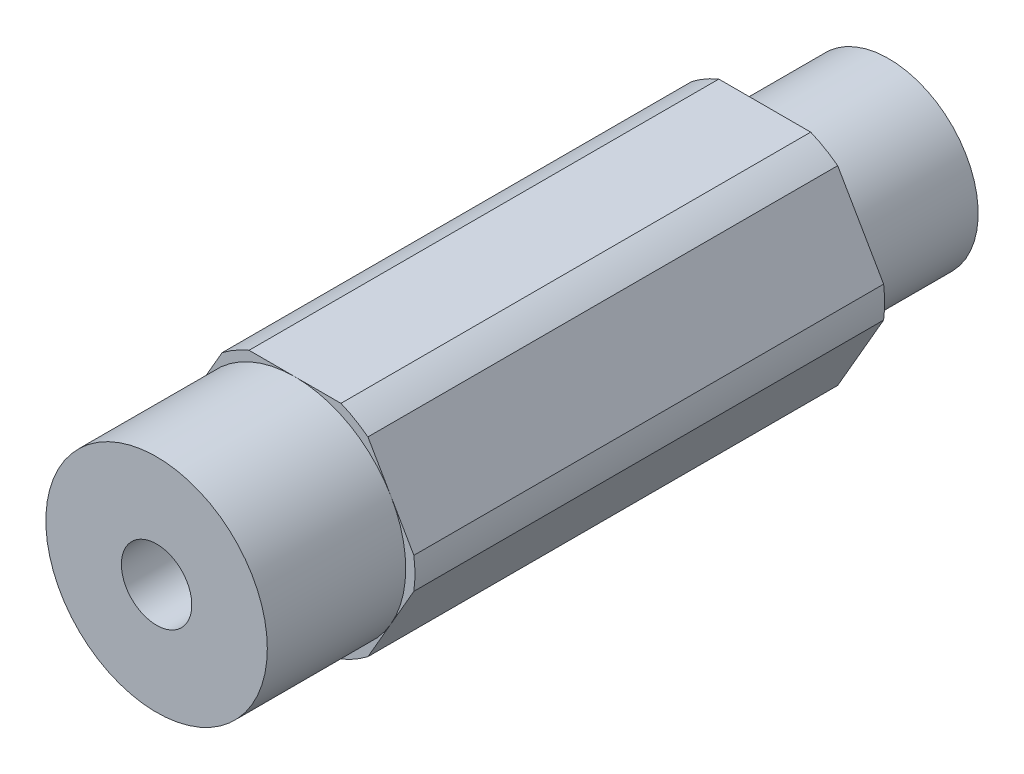
ISO-10303-21;
HEADER;
FILE_DESCRIPTION(('STEP AP214'),'2;1');
FILE_NAME('part.step','',(''),(''),'','','');
FILE_SCHEMA(('AUTOMOTIVE_DESIGN { 1 0 10303 214 1 1 1 1 }'));
ENDSEC;
DATA;
#1=APPLICATION_CONTEXT('core data for automotive mechanical design processes');
#2=APPLICATION_PROTOCOL_DEFINITION('international standard','automotive_design',2000,#1);
#3=PRODUCT_CONTEXT('',#1,'mechanical');
#4=PRODUCT('Part','Part','',(#3));
#5=PRODUCT_RELATED_PRODUCT_CATEGORY('part','',(#4));
#6=PRODUCT_DEFINITION_FORMATION('','',#4);
#7=PRODUCT_DEFINITION_CONTEXT('part definition',#1,'design');
#8=PRODUCT_DEFINITION('design','',#6,#7);
#9=PRODUCT_DEFINITION_SHAPE('','',#8);
#10=(LENGTH_UNIT() NAMED_UNIT(*) SI_UNIT(.MILLI.,.METRE.));
#11=(NAMED_UNIT(*) PLANE_ANGLE_UNIT() SI_UNIT($,.RADIAN.));
#12=(NAMED_UNIT(*) SI_UNIT($,.STERADIAN.) SOLID_ANGLE_UNIT());
#13=UNCERTAINTY_MEASURE_WITH_UNIT(LENGTH_MEASURE(1.E-05),#10,'distance_accuracy_value','');
#14=(GEOMETRIC_REPRESENTATION_CONTEXT(3) GLOBAL_UNCERTAINTY_ASSIGNED_CONTEXT((#13)) GLOBAL_UNIT_ASSIGNED_CONTEXT((#10,
#11,#12)) REPRESENTATION_CONTEXT('',''));
#15=CARTESIAN_POINT('',(0.,0.,0.));
#16=DIRECTION('',(0.,0.,1.));
#17=DIRECTION('',(1.,0.,0.));
#18=AXIS2_PLACEMENT_3D('',#15,#16,#17);
#19=CARTESIAN_POINT('',(5.49926131403115,3.17499999999999,20.9931));
#20=DIRECTION('',(-0.866025403784438,-0.500000000000001,0.));
#21=DIRECTION('',(0.500000000000001,-0.866025403784438,0.));
#22=AXIS2_PLACEMENT_3D('',#19,#20,#21);
#23=PLANE('',#22);
#24=DIRECTION('',(0.500000000000001,-0.866025403784438,0.));
#25=VECTOR('',#24,1.);
#26=CARTESIAN_POINT('',(5.49926131403115,3.17499999999999,-13.8811));
#27=LINE('',#26,#25);
#28=CARTESIAN_POINT('',(4.18177084608646,5.45696042896789,-13.8811));
#29=VERTEX_POINT('',#28);
#30=CARTESIAN_POINT('',(6.81675178197584,0.89303957103209,-13.8811));
#31=VERTEX_POINT('',#30);
#32=EDGE_CURVE('E71',#29,#31,#27,.T.);
#33=ORIENTED_EDGE('',*,*,#32,.F.);
#34=DIRECTION('',(0.,0.,-1.));
#35=VECTOR('',#34,1.);
#36=CARTESIAN_POINT('',(4.18177084608646,5.45696042896789,20.9931));
#37=LINE('',#36,#35);
#38=CARTESIAN_POINT('',(4.18177084608646,5.45696042896789,13.0556));
#39=VERTEX_POINT('',#38);
#40=EDGE_CURVE('E212',#39,#29,#37,.T.);
#41=ORIENTED_EDGE('',*,*,#40,.F.);
#42=DIRECTION('',(-0.500000000000001,0.866025403784438,0.));
#43=VECTOR('',#42,1.);
#44=CARTESIAN_POINT('',(5.49926131403115,3.17499999999999,13.0556));
#45=LINE('',#44,#43);
#46=CARTESIAN_POINT('',(5.49926131403118,3.17500000000001,13.0556));
#47=VERTEX_POINT('',#46);
#48=EDGE_CURVE('E224',#47,#39,#45,.T.);
#49=ORIENTED_EDGE('',*,*,#48,.F.);
#50=CARTESIAN_POINT('',(6.81675178197584,0.89303957103209,13.0556));
#51=VERTEX_POINT('',#50);
#52=EDGE_CURVE('E219',#51,#47,#45,.T.);
#53=ORIENTED_EDGE('',*,*,#52,.F.);
#54=DIRECTION('',(0.,0.,-1.));
#55=VECTOR('',#54,1.);
#56=CARTESIAN_POINT('',(6.81675178197584,0.89303957103209,20.9931));
#57=LINE('',#56,#55);
#58=EDGE_CURVE('E181',#51,#31,#57,.T.);
#59=ORIENTED_EDGE('',*,*,#58,.T.);
#60=EDGE_LOOP('',(#33,#41,#49,#53,#59));
#61=FACE_BOUND('',#60,.T.);
#62=ADVANCED_FACE('F57',(#61),#23,.F.);
#63=CARTESIAN_POINT('',(0.,0.,20.9931));
#64=DIRECTION('',(0.,0.,-1.));
#65=DIRECTION('',(-1.,0.,0.));
#66=AXIS2_PLACEMENT_3D('',#63,#64,#65);
#67=CYLINDRICAL_SURFACE('',#66,6.874999966);
#68=CARTESIAN_POINT('',(0.,0.,-13.8811));
#69=DIRECTION('',(0.,0.,-1.));
#70=DIRECTION('',(-1.,0.,0.));
#71=AXIS2_PLACEMENT_3D('',#68,#69,#70);
#72=CIRCLE('',#71,6.874999966);
#73=CARTESIAN_POINT('',(2.63498093588936,6.34999999999997,-13.8811));
#74=VERTEX_POINT('',#73);
#75=EDGE_CURVE('E300',#74,#29,#72,.T.);
#76=ORIENTED_EDGE('',*,*,#75,.F.);
#77=DIRECTION('',(0.,0.,-1.));
#78=VECTOR('',#77,1.);
#79=CARTESIAN_POINT('',(2.63498093588936,6.34999999999997,20.9931));
#80=LINE('',#79,#78);
#81=CARTESIAN_POINT('',(2.63498093588936,6.34999999999997,13.0556));
#82=VERTEX_POINT('',#81);
#83=EDGE_CURVE('E209',#82,#74,#80,.T.);
#84=ORIENTED_EDGE('',*,*,#83,.F.);
#85=CARTESIAN_POINT('',(0.,0.,13.0556));
#86=DIRECTION('',(0.,0.,1.));
#87=DIRECTION('',(1.,0.,0.));
#88=AXIS2_PLACEMENT_3D('',#85,#86,#87);
#89=CIRCLE('',#88,6.874999966);
#90=EDGE_CURVE('E228',#39,#82,#89,.T.);
#91=ORIENTED_EDGE('',*,*,#90,.F.);
#92=ORIENTED_EDGE('',*,*,#40,.T.);
#93=EDGE_LOOP('',(#76,#84,#91,#92));
#94=FACE_BOUND('',#93,.T.);
#95=ADVANCED_FACE('F299',(#94),#67,.T.);
#96=CARTESIAN_POINT('',(0.,6.34999999999996,20.9931));
#97=DIRECTION('',(0.,-1.,0.));
#98=DIRECTION('',(1.,0.,0.));
#99=AXIS2_PLACEMENT_3D('',#96,#97,#98);
#100=PLANE('',#99);
#101=DIRECTION('',(1.,0.,0.));
#102=VECTOR('',#101,1.);
#103=CARTESIAN_POINT('',(0.,6.34999999999996,-13.8811));
#104=LINE('',#103,#102);
#105=CARTESIAN_POINT('',(-2.6349809358894,6.34999999999995,-13.8811));
#106=VERTEX_POINT('',#105);
#107=EDGE_CURVE('E301',#106,#74,#104,.T.);
#108=ORIENTED_EDGE('',*,*,#107,.F.);
#109=DIRECTION('',(0.,0.,-1.));
#110=VECTOR('',#109,1.);
#111=CARTESIAN_POINT('',(-2.6349809358894,6.34999999999995,20.9931));
#112=LINE('',#111,#110);
#113=CARTESIAN_POINT('',(-2.6349809358894,6.34999999999995,13.0556));
#114=VERTEX_POINT('',#113);
#115=EDGE_CURVE('E206',#114,#106,#112,.T.);
#116=ORIENTED_EDGE('',*,*,#115,.F.);
#117=DIRECTION('',(-1.,0.,0.));
#118=VECTOR('',#117,1.);
#119=CARTESIAN_POINT('',(0.,6.34999999999996,13.0556));
#120=LINE('',#119,#118);
#121=CARTESIAN_POINT('',(0.,6.35,13.0556));
#122=VERTEX_POINT('',#121);
#123=EDGE_CURVE('E289',#122,#114,#120,.T.);
#124=ORIENTED_EDGE('',*,*,#123,.F.);
#125=EDGE_CURVE('E264',#82,#122,#120,.T.);
#126=ORIENTED_EDGE('',*,*,#125,.F.);
#127=ORIENTED_EDGE('',*,*,#83,.T.);
#128=EDGE_LOOP('',(#108,#116,#124,#126,#127));
#129=FACE_BOUND('',#128,.T.);
#130=ADVANCED_FACE('F296',(#129),#100,.F.);
#131=CARTESIAN_POINT('',(0.,0.,-13.8811));
#132=DIRECTION('',(0.,0.,-1.));
#133=DIRECTION('',(-1.,0.,0.));
#134=AXIS2_PLACEMENT_3D('',#131,#132,#133);
#135=CIRCLE('',#134,6.874999966);
#136=CARTESIAN_POINT('',(-4.18177084608649,5.45696042896786,-13.8811));
#137=VERTEX_POINT('',#136);
#138=EDGE_CURVE('E302',#137,#106,#135,.T.);
#139=ORIENTED_EDGE('',*,*,#138,.F.);
#140=DIRECTION('',(0.,0.,-1.));
#141=VECTOR('',#140,1.);
#142=CARTESIAN_POINT('',(-4.18177084608649,5.45696042896786,20.9931));
#143=LINE('',#142,#141);
#144=CARTESIAN_POINT('',(-4.18177084608649,5.45696042896786,13.0556));
#145=VERTEX_POINT('',#144);
#146=EDGE_CURVE('E203',#145,#137,#143,.T.);
#147=ORIENTED_EDGE('',*,*,#146,.F.);
#148=CARTESIAN_POINT('',(0.,0.,13.0556));
#149=DIRECTION('',(0.,0.,1.));
#150=DIRECTION('',(1.,0.,0.));
#151=AXIS2_PLACEMENT_3D('',#148,#149,#150);
#152=CIRCLE('',#151,6.874999966);
#153=EDGE_CURVE('E288',#114,#145,#152,.T.);
#154=ORIENTED_EDGE('',*,*,#153,.F.);
#155=ORIENTED_EDGE('',*,*,#115,.T.);
#156=EDGE_LOOP('',(#139,#147,#154,#155));
#157=FACE_BOUND('',#156,.T.);
#158=ADVANCED_FACE('F337',(#157),#67,.T.);
#159=CARTESIAN_POINT('',(-5.49926131403117,3.17499999999995,20.9931));
#160=DIRECTION('',(0.866025403784442,-0.499999999999995,0.));
#161=DIRECTION('',(0.499999999999995,0.866025403784442,0.));
#162=AXIS2_PLACEMENT_3D('',#159,#160,#161);
#163=PLANE('',#162);
#164=DIRECTION('',(0.499999999999995,0.866025403784442,0.));
#165=VECTOR('',#164,1.);
#166=CARTESIAN_POINT('',(-5.49926131403117,3.17499999999995,-13.8811));
#167=LINE('',#166,#165);
#168=CARTESIAN_POINT('',(-6.81675178197585,0.893039571032039,-13.8811));
#169=VERTEX_POINT('',#168);
#170=EDGE_CURVE('E306',#169,#137,#167,.T.);
#171=ORIENTED_EDGE('',*,*,#170,.F.);
#172=DIRECTION('',(0.,0.,-1.));
#173=VECTOR('',#172,1.);
#174=CARTESIAN_POINT('',(-6.81675178197585,0.893039571032039,20.9931));
#175=LINE('',#174,#173);
#176=CARTESIAN_POINT('',(-6.81675178197585,0.893039571032039,13.0556));
#177=VERTEX_POINT('',#176);
#178=EDGE_CURVE('E200',#177,#169,#175,.T.);
#179=ORIENTED_EDGE('',*,*,#178,.F.);
#180=DIRECTION('',(-0.499999999999995,-0.866025403784442,0.));
#181=VECTOR('',#180,1.);
#182=CARTESIAN_POINT('',(-5.49926131403117,3.17499999999995,13.0556));
#183=LINE('',#182,#181);
#184=CARTESIAN_POINT('',(-5.4992613140312,3.17499999999997,13.0556));
#185=VERTEX_POINT('',#184);
#186=EDGE_CURVE('E285',#185,#177,#183,.T.);
#187=ORIENTED_EDGE('',*,*,#186,.F.);
#188=EDGE_CURVE('E287',#145,#185,#183,.T.);
#189=ORIENTED_EDGE('',*,*,#188,.F.);
#190=ORIENTED_EDGE('',*,*,#146,.T.);
#191=EDGE_LOOP('',(#171,#179,#187,#189,#190));
#192=FACE_BOUND('',#191,.T.);
#193=ADVANCED_FACE('F341',(#192),#163,.F.);
#194=CARTESIAN_POINT('',(0.,0.,-13.8811));
#195=DIRECTION('',(0.,0.,-1.));
#196=DIRECTION('',(-1.,0.,0.));
#197=AXIS2_PLACEMENT_3D('',#194,#195,#196);
#198=CIRCLE('',#197,6.874999966);
#199=CARTESIAN_POINT('',(-6.81675178197584,-0.893039571032139,-13.8811));
#200=VERTEX_POINT('',#199);
#201=EDGE_CURVE('E308',#200,#169,#198,.T.);
#202=ORIENTED_EDGE('',*,*,#201,.F.);
#203=DIRECTION('',(0.,0.,-1.));
#204=VECTOR('',#203,1.);
#205=CARTESIAN_POINT('',(-6.81675178197584,-0.893039571032139,20.9931));
#206=LINE('',#205,#204);
#207=CARTESIAN_POINT('',(-6.81675178197584,-0.893039571032139,13.0556));
#208=VERTEX_POINT('',#207);
#209=EDGE_CURVE('E197',#208,#200,#206,.T.);
#210=ORIENTED_EDGE('',*,*,#209,.F.);
#211=CARTESIAN_POINT('',(0.,0.,13.0556));
#212=DIRECTION('',(0.,0.,1.));
#213=DIRECTION('',(1.,0.,0.));
#214=AXIS2_PLACEMENT_3D('',#211,#212,#213);
#215=CIRCLE('',#214,6.874999966);
#216=EDGE_CURVE('E283',#177,#208,#215,.T.);
#217=ORIENTED_EDGE('',*,*,#216,.F.);
#218=ORIENTED_EDGE('',*,*,#178,.T.);
#219=EDGE_LOOP('',(#202,#210,#217,#218));
#220=FACE_BOUND('',#219,.T.);
#221=ADVANCED_FACE('F344',(#220),#67,.T.);
#222=CARTESIAN_POINT('',(-5.49926131403113,-3.17500000000003,20.9931));
#223=DIRECTION('',(0.866025403784434,0.500000000000007,0.));
#224=DIRECTION('',(-0.500000000000007,0.866025403784435,0.));
#225=AXIS2_PLACEMENT_3D('',#222,#223,#224);
#226=PLANE('',#225);
#227=DIRECTION('',(-0.500000000000007,0.866025403784435,0.));
#228=VECTOR('',#227,1.);
#229=CARTESIAN_POINT('',(-5.49926131403113,-3.17500000000003,-13.8811));
#230=LINE('',#229,#228);
#231=CARTESIAN_POINT('',(-4.18177084608642,-5.45696042896791,-13.8811));
#232=VERTEX_POINT('',#231);
#233=EDGE_CURVE('E310',#232,#200,#230,.T.);
#234=ORIENTED_EDGE('',*,*,#233,.F.);
#235=DIRECTION('',(0.,0.,-1.));
#236=VECTOR('',#235,1.);
#237=CARTESIAN_POINT('',(-4.18177084608642,-5.45696042896791,20.9931));
#238=LINE('',#237,#236);
#239=CARTESIAN_POINT('',(-4.18177084608642,-5.45696042896791,13.0556));
#240=VERTEX_POINT('',#239);
#241=EDGE_CURVE('E194',#240,#232,#238,.T.);
#242=ORIENTED_EDGE('',*,*,#241,.F.);
#243=DIRECTION('',(0.500000000000007,-0.866025403784435,0.));
#244=VECTOR('',#243,1.);
#245=CARTESIAN_POINT('',(-5.49926131403113,-3.17500000000003,13.0556));
#246=LINE('',#245,#244);
#247=CARTESIAN_POINT('',(-5.49926131403116,-3.17500000000004,13.0556));
#248=VERTEX_POINT('',#247);
#249=EDGE_CURVE('E280',#248,#240,#246,.T.);
#250=ORIENTED_EDGE('',*,*,#249,.F.);
#251=EDGE_CURVE('E282',#208,#248,#246,.T.);
#252=ORIENTED_EDGE('',*,*,#251,.F.);
#253=ORIENTED_EDGE('',*,*,#209,.T.);
#254=EDGE_LOOP('',(#234,#242,#250,#252,#253));
#255=FACE_BOUND('',#254,.T.);
#256=ADVANCED_FACE('F346',(#255),#226,.F.);
#257=CARTESIAN_POINT('',(0.,0.,-13.8811));
#258=DIRECTION('',(0.,0.,-1.));
#259=DIRECTION('',(-1.,0.,0.));
#260=AXIS2_PLACEMENT_3D('',#257,#258,#259);
#261=CIRCLE('',#260,6.874999966);
#262=CARTESIAN_POINT('',(-2.63498093588932,-6.34999999999999,-13.8811));
#263=VERTEX_POINT('',#262);
#264=EDGE_CURVE('E312',#263,#232,#261,.T.);
#265=ORIENTED_EDGE('',*,*,#264,.F.);
#266=DIRECTION('',(0.,0.,-1.));
#267=VECTOR('',#266,1.);
#268=CARTESIAN_POINT('',(-2.63498093588932,-6.34999999999999,20.9931));
#269=LINE('',#268,#267);
#270=CARTESIAN_POINT('',(-2.63498093588932,-6.34999999999999,13.0556));
#271=VERTEX_POINT('',#270);
#272=EDGE_CURVE('E191',#271,#263,#269,.T.);
#273=ORIENTED_EDGE('',*,*,#272,.F.);
#274=CARTESIAN_POINT('',(0.,0.,13.0556));
#275=DIRECTION('',(0.,0.,1.));
#276=DIRECTION('',(1.,0.,0.));
#277=AXIS2_PLACEMENT_3D('',#274,#275,#276);
#278=CIRCLE('',#277,6.874999966);
#279=EDGE_CURVE('E278',#240,#271,#278,.T.);
#280=ORIENTED_EDGE('',*,*,#279,.F.);
#281=ORIENTED_EDGE('',*,*,#241,.T.);
#282=EDGE_LOOP('',(#265,#273,#280,#281));
#283=FACE_BOUND('',#282,.T.);
#284=ADVANCED_FACE('F349',(#283),#67,.T.);
#285=CARTESIAN_POINT('',(0.,-6.34999999999996,20.9931));
#286=DIRECTION('',(0.,1.,0.));
#287=DIRECTION('',(-1.,0.,0.));
#288=AXIS2_PLACEMENT_3D('',#285,#286,#287);
#289=PLANE('',#288);
#290=DIRECTION('',(-1.,0.,0.));
#291=VECTOR('',#290,1.);
#292=CARTESIAN_POINT('',(0.,-6.34999999999996,-13.8811));
#293=LINE('',#292,#291);
#294=CARTESIAN_POINT('',(2.63498093588945,-6.34999999999994,-13.8811));
#295=VERTEX_POINT('',#294);
#296=EDGE_CURVE('E314',#295,#263,#293,.T.);
#297=ORIENTED_EDGE('',*,*,#296,.F.);
#298=DIRECTION('',(0.,0.,-1.));
#299=VECTOR('',#298,1.);
#300=CARTESIAN_POINT('',(2.63498093588945,-6.34999999999993,20.9931));
#301=LINE('',#300,#299);
#302=CARTESIAN_POINT('',(2.63498093588945,-6.34999999999994,13.0556));
#303=VERTEX_POINT('',#302);
#304=EDGE_CURVE('E183',#303,#295,#301,.T.);
#305=ORIENTED_EDGE('',*,*,#304,.F.);
#306=DIRECTION('',(1.,0.,0.));
#307=VECTOR('',#306,1.);
#308=CARTESIAN_POINT('',(0.,-6.34999999999996,13.0556));
#309=LINE('',#308,#307);
#310=CARTESIAN_POINT('',(0.,-6.35,13.0556));
#311=VERTEX_POINT('',#310);
#312=EDGE_CURVE('E275',#311,#303,#309,.T.);
#313=ORIENTED_EDGE('',*,*,#312,.F.);
#314=EDGE_CURVE('E277',#271,#311,#309,.T.);
#315=ORIENTED_EDGE('',*,*,#314,.F.);
#316=ORIENTED_EDGE('',*,*,#272,.T.);
#317=EDGE_LOOP('',(#297,#305,#313,#315,#316));
#318=FACE_BOUND('',#317,.T.);
#319=ADVANCED_FACE('F351',(#318),#289,.F.);
#320=CARTESIAN_POINT('',(0.,0.,-13.8811));
#321=DIRECTION('',(0.,0.,-1.));
#322=DIRECTION('',(-1.,0.,0.));
#323=AXIS2_PLACEMENT_3D('',#320,#321,#322);
#324=CIRCLE('',#323,6.874999966);
#325=CARTESIAN_POINT('',(4.18177084608655,-5.45696042896781,-13.8811));
#326=VERTEX_POINT('',#325);
#327=EDGE_CURVE('E177',#326,#295,#324,.T.);
#328=ORIENTED_EDGE('',*,*,#327,.F.);
#329=DIRECTION('',(0.,0.,-1.));
#330=VECTOR('',#329,1.);
#331=CARTESIAN_POINT('',(4.18177084608655,-5.45696042896782,20.9931));
#332=LINE('',#331,#330);
#333=CARTESIAN_POINT('',(4.18177084608655,-5.45696042896781,13.0556));
#334=VERTEX_POINT('',#333);
#335=EDGE_CURVE('E176',#334,#326,#332,.T.);
#336=ORIENTED_EDGE('',*,*,#335,.F.);
#337=CARTESIAN_POINT('',(0.,0.,13.0556));
#338=DIRECTION('',(0.,0.,1.));
#339=DIRECTION('',(1.,0.,0.));
#340=AXIS2_PLACEMENT_3D('',#337,#338,#339);
#341=CIRCLE('',#340,6.874999966);
#342=EDGE_CURVE('E273',#303,#334,#341,.T.);
#343=ORIENTED_EDGE('',*,*,#342,.F.);
#344=ORIENTED_EDGE('',*,*,#304,.T.);
#345=EDGE_LOOP('',(#328,#336,#343,#344));
#346=FACE_BOUND('',#345,.T.);
#347=ADVANCED_FACE('F354',(#346),#67,.T.);
#348=CARTESIAN_POINT('',(5.49926131403119,-3.17499999999996,20.9931));
#349=DIRECTION('',(-0.866025403784441,0.499999999999995,0.));
#350=DIRECTION('',(-0.499999999999995,-0.866025403784442,0.));
#351=AXIS2_PLACEMENT_3D('',#348,#349,#350);
#352=PLANE('',#351);
#353=DIRECTION('',(-0.499999999999995,-0.866025403784442,0.));
#354=VECTOR('',#353,1.);
#355=CARTESIAN_POINT('',(5.49926131403119,-3.17499999999996,-13.8811));
#356=LINE('',#355,#354);
#357=CARTESIAN_POINT('',(6.81675178197584,-0.893039571032111,-13.8811));
#358=VERTEX_POINT('',#357);
#359=EDGE_CURVE('E163',#358,#326,#356,.T.);
#360=ORIENTED_EDGE('',*,*,#359,.F.);
#361=DIRECTION('',(0.,0.,-1.));
#362=VECTOR('',#361,1.);
#363=CARTESIAN_POINT('',(6.81675178197584,-0.893039571032111,20.9931));
#364=LINE('',#363,#362);
#365=CARTESIAN_POINT('',(6.81675178197584,-0.893039571032111,13.0556));
#366=VERTEX_POINT('',#365);
#367=EDGE_CURVE('E173',#366,#358,#364,.T.);
#368=ORIENTED_EDGE('',*,*,#367,.F.);
#369=DIRECTION('',(0.499999999999995,0.866025403784442,0.));
#370=VECTOR('',#369,1.);
#371=CARTESIAN_POINT('',(5.49926131403119,-3.17499999999996,13.0556));
#372=LINE('',#371,#370);
#373=CARTESIAN_POINT('',(5.4992613140312,-3.17499999999997,13.0556));
#374=VERTEX_POINT('',#373);
#375=EDGE_CURVE('E79',#374,#366,#372,.T.);
#376=ORIENTED_EDGE('',*,*,#375,.F.);
#377=EDGE_CURVE('E267',#334,#374,#372,.T.);
#378=ORIENTED_EDGE('',*,*,#377,.F.);
#379=ORIENTED_EDGE('',*,*,#335,.T.);
#380=EDGE_LOOP('',(#360,#368,#376,#378,#379));
#381=FACE_BOUND('',#380,.T.);
#382=ADVANCED_FACE('F172',(#381),#352,.F.);
#383=CARTESIAN_POINT('',(0.,0.,-13.8811));
#384=DIRECTION('',(0.,0.,-1.));
#385=DIRECTION('',(-1.,0.,0.));
#386=AXIS2_PLACEMENT_3D('',#383,#384,#385);
#387=CIRCLE('',#386,6.874999966);
#388=EDGE_CURVE('E12',#31,#358,#387,.T.);
#389=ORIENTED_EDGE('',*,*,#388,.F.);
#390=ORIENTED_EDGE('',*,*,#58,.F.);
#391=CARTESIAN_POINT('',(0.,0.,13.0556));
#392=DIRECTION('',(0.,0.,1.));
#393=DIRECTION('',(1.,0.,0.));
#394=AXIS2_PLACEMENT_3D('',#391,#392,#393);
#395=CIRCLE('',#394,6.874999966);
#396=EDGE_CURVE('E65',#366,#51,#395,.T.);
#397=ORIENTED_EDGE('',*,*,#396,.F.);
#398=ORIENTED_EDGE('',*,*,#367,.T.);
#399=EDGE_LOOP('',(#389,#390,#397,#398));
#400=FACE_BOUND('',#399,.T.);
#401=ADVANCED_FACE('F180',(#400),#67,.T.);
#402=CARTESIAN_POINT('',(0.,0.,-20.9931));
#403=DIRECTION('',(0.,0.,1.));
#404=DIRECTION('',(1.,0.,0.));
#405=AXIS2_PLACEMENT_3D('',#402,#403,#404);
#406=PLANE('',#405);
#407=CARTESIAN_POINT('',(0.,0.,-20.9931));
#408=DIRECTION('',(0.,0.,1.));
#409=DIRECTION('',(1.,0.,0.));
#410=AXIS2_PLACEMENT_3D('',#407,#408,#409);
#411=CIRCLE('',#410,2.0193);
#412=CARTESIAN_POINT('',(-2.0193,0.,-20.9931));
#413=VERTEX_POINT('',#412);
#414=EDGE_CURVE('E225',#413,#413,#411,.T.);
#415=ORIENTED_EDGE('',*,*,#414,.T.);
#416=EDGE_LOOP('',(#415));
#417=FACE_BOUND('',#416,.T.);
#418=CARTESIAN_POINT('',(0.,0.,-20.9931));
#419=DIRECTION('',(0.,0.,-1.));
#420=DIRECTION('',(-1.,0.,0.));
#421=AXIS2_PLACEMENT_3D('',#418,#419,#420);
#422=CIRCLE('',#421,5.125000037);
#423=CARTESIAN_POINT('',(-5.125000037,0.,-20.9931));
#424=VERTEX_POINT('',#423);
#425=EDGE_CURVE('E317',#424,#424,#422,.T.);
#426=ORIENTED_EDGE('',*,*,#425,.T.);
#427=EDGE_LOOP('',(#426));
#428=FACE_BOUND('',#427,.T.);
#429=ADVANCED_FACE('F240',(#417,#428),#406,.F.);
#430=CARTESIAN_POINT('',(0.,0.,20.9931));
#431=DIRECTION('',(0.,0.,1.));
#432=DIRECTION('',(1.,0.,0.));
#433=AXIS2_PLACEMENT_3D('',#430,#431,#432);
#434=PLANE('',#433);
#435=CARTESIAN_POINT('',(0.,0.,20.9931));
#436=DIRECTION('',(0.,0.,1.));
#437=DIRECTION('',(1.,0.,0.));
#438=AXIS2_PLACEMENT_3D('',#435,#436,#437);
#439=CIRCLE('',#438,2.0193);
#440=CARTESIAN_POINT('',(-2.0193,0.,20.9931));
#441=VERTEX_POINT('',#440);
#442=EDGE_CURVE('E185',#441,#441,#439,.T.);
#443=ORIENTED_EDGE('',*,*,#442,.F.);
#444=EDGE_LOOP('',(#443));
#445=FACE_BOUND('',#444,.T.);
#446=CARTESIAN_POINT('',(0.,0.,20.9931));
#447=DIRECTION('',(0.,0.,1.));
#448=DIRECTION('',(1.,0.,0.));
#449=AXIS2_PLACEMENT_3D('',#446,#447,#448);
#450=CIRCLE('',#449,6.35);
#451=CARTESIAN_POINT('',(6.35,0.,20.9931));
#452=VERTEX_POINT('',#451);
#453=EDGE_CURVE('E215',#452,#452,#450,.T.);
#454=ORIENTED_EDGE('',*,*,#453,.T.);
#455=EDGE_LOOP('',(#454));
#456=FACE_BOUND('',#455,.T.);
#457=ADVANCED_FACE('F237',(#445,#456),#434,.T.);
#458=CARTESIAN_POINT('',(0.,0.,20.9931));
#459=DIRECTION('',(0.,0.,-1.));
#460=DIRECTION('',(-1.,0.,0.));
#461=AXIS2_PLACEMENT_3D('',#458,#459,#460);
#462=CYLINDRICAL_SURFACE('',#461,2.0193);
#463=CARTESIAN_POINT('',(-2.0193,0.,20.9931));
#464=CARTESIAN_POINT('',(-2.0193,0.,20.55574375));
#465=CARTESIAN_POINT('',(-2.0193,0.,20.1183875));
#466=CARTESIAN_POINT('',(-2.0193,0.,19.243675));
#467=CARTESIAN_POINT('',(-2.0193,0.,18.80631875));
#468=CARTESIAN_POINT('',(-2.0193,0.,17.93160625));
#469=CARTESIAN_POINT('',(-2.0193,0.,17.49425));
#470=CARTESIAN_POINT('',(-2.0193,0.,16.6195375));
#471=CARTESIAN_POINT('',(-2.0193,0.,16.18218125));
#472=CARTESIAN_POINT('',(-2.0193,0.,15.30746875));
#473=CARTESIAN_POINT('',(-2.0193,0.,14.8701125));
#474=CARTESIAN_POINT('',(-2.0193,0.,13.9954));
#475=CARTESIAN_POINT('',(-2.0193,0.,13.55804375));
#476=CARTESIAN_POINT('',(-2.0193,0.,12.68333125));
#477=CARTESIAN_POINT('',(-2.0193,0.,12.245975));
#478=CARTESIAN_POINT('',(-2.0193,0.,11.3712625));
#479=CARTESIAN_POINT('',(-2.0193,0.,10.93390625));
#480=CARTESIAN_POINT('',(-2.0193,0.,10.05919375));
#481=CARTESIAN_POINT('',(-2.0193,0.,9.6218375));
#482=CARTESIAN_POINT('',(-2.0193,0.,8.747125));
#483=CARTESIAN_POINT('',(-2.0193,0.,8.30976874999999));
#484=CARTESIAN_POINT('',(-2.0193,0.,7.43505625));
#485=CARTESIAN_POINT('',(-2.0193,0.,6.9977));
#486=CARTESIAN_POINT('',(-2.0193,0.,6.1229875));
#487=CARTESIAN_POINT('',(-2.0193,0.,5.68563125));
#488=CARTESIAN_POINT('',(-2.0193,0.,4.81091875));
#489=CARTESIAN_POINT('',(-2.0193,0.,4.37356249999999));
#490=CARTESIAN_POINT('',(-2.0193,0.,3.49884999999999));
#491=CARTESIAN_POINT('',(-2.0193,0.,3.06149374999999));
#492=CARTESIAN_POINT('',(-2.0193,0.,2.18678124999999));
#493=CARTESIAN_POINT('',(-2.0193,0.,1.74942499999999));
#494=CARTESIAN_POINT('',(-2.0193,0.,0.874712499999992));
#495=CARTESIAN_POINT('',(-2.0193,0.,0.437356249999993));
#496=CARTESIAN_POINT('',(-2.0193,0.,-0.437356250000007));
#497=CARTESIAN_POINT('',(-2.0193,0.,-0.874712500000006));
#498=CARTESIAN_POINT('',(-2.0193,0.,-1.74942500000001));
#499=CARTESIAN_POINT('',(-2.0193,0.,-2.18678125000001));
#500=CARTESIAN_POINT('',(-2.0193,0.,-3.06149375000001));
#501=CARTESIAN_POINT('',(-2.0193,0.,-3.49885000000001));
#502=CARTESIAN_POINT('',(-2.0193,0.,-4.37356250000001));
#503=CARTESIAN_POINT('',(-2.0193,0.,-4.81091875000001));
#504=CARTESIAN_POINT('',(-2.0193,0.,-5.68563125000001));
#505=CARTESIAN_POINT('',(-2.0193,0.,-6.12298750000001));
#506=CARTESIAN_POINT('',(-2.0193,0.,-6.99770000000001));
#507=CARTESIAN_POINT('',(-2.0193,0.,-7.43505625000001));
#508=CARTESIAN_POINT('',(-2.0193,0.,-8.30976875000001));
#509=CARTESIAN_POINT('',(-2.0193,0.,-8.74712500000001));
#510=CARTESIAN_POINT('',(-2.0193,0.,-9.62183750000001));
#511=CARTESIAN_POINT('',(-2.0193,0.,-10.05919375));
#512=CARTESIAN_POINT('',(-2.0193,0.,-10.93390625));
#513=CARTESIAN_POINT('',(-2.0193,0.,-11.3712625));
#514=CARTESIAN_POINT('',(-2.0193,0.,-12.245975));
#515=CARTESIAN_POINT('',(-2.0193,0.,-12.68333125));
#516=CARTESIAN_POINT('',(-2.0193,0.,-13.55804375));
#517=CARTESIAN_POINT('',(-2.0193,0.,-13.9954));
#518=CARTESIAN_POINT('',(-2.0193,0.,-14.8701125));
#519=CARTESIAN_POINT('',(-2.0193,0.,-15.30746875));
#520=CARTESIAN_POINT('',(-2.0193,0.,-16.18218125));
#521=CARTESIAN_POINT('',(-2.0193,0.,-16.6195375));
#522=CARTESIAN_POINT('',(-2.0193,0.,-17.49425));
#523=CARTESIAN_POINT('',(-2.0193,0.,-17.93160625));
#524=CARTESIAN_POINT('',(-2.0193,0.,-18.80631875));
#525=CARTESIAN_POINT('',(-2.0193,0.,-19.243675));
#526=CARTESIAN_POINT('',(-2.0193,0.,-20.1183875));
#527=CARTESIAN_POINT('',(-2.0193,0.,-20.55574375));
#528=CARTESIAN_POINT('',(-2.0193,0.,-20.9931));
#529=B_SPLINE_CURVE_WITH_KNOTS('',3,(#463,#464,#465,#466,#467,#468,#469,#470,#471,#472,#473,
#474,#475,#476,#477,#478,#479,#480,#481,#482,#483,#484,#485,#486,#487,#488,#489,#490,#491,#492,
#493,#494,#495,#496,#497,#498,#499,#500,#501,#502,#503,#504,#505,#506,#507,#508,#509,#510,#511,
#512,#513,#514,#515,#516,#517,#518,#519,#520,#521,#522,#523,#524,#525,#526,#527,#528),
.UNSPECIFIED.,.F.,.F.,(4,2,2,2,2,2,2,2,2,2,2,2,2,2,2,2,2,2,2,2,2,2,2,2,2,2,2,2,2,2,2,2,4),(0.,
1.31206875,2.6241375,3.93620625,5.248275,6.56034375,7.8724125,9.18448125,10.49655,11.80861875,
13.1206875,14.43275625,15.744825,17.05689375,18.3689625,19.68103125,20.9931,22.30516875,
23.6172375,24.92930625,26.241375,27.55344375,28.8655125,30.17758125,31.48965,32.80171875,
34.1137875,35.42585625,36.737925,38.04999375,39.3620625,40.67413125,41.9862),.UNSPECIFIED.);
#530=EDGE_CURVE('BSEAM59',#441,#413,#529,.T.);
#531=ORIENTED_EDGE('',*,*,#442,.T.);
#532=ORIENTED_EDGE('',*,*,#414,.F.);
#533=ORIENTED_EDGE('',*,*,#530,.T.);
#534=ORIENTED_EDGE('',*,*,#530,.F.);
#535=EDGE_LOOP('',(#531,#533,#532,#534));
#536=FACE_BOUND('',#535,.T.);
#537=ADVANCED_FACE('F59',(#536),#462,.F.);
#538=CARTESIAN_POINT('',(0.,0.,13.0556));
#539=DIRECTION('',(0.,0.,1.));
#540=DIRECTION('',(1.,0.,0.));
#541=AXIS2_PLACEMENT_3D('',#538,#539,#540);
#542=PLANE('',#541);
#543=ORIENTED_EDGE('',*,*,#52,.T.);
#544=CARTESIAN_POINT('',(0.,0.,13.0556));
#545=DIRECTION('',(0.,0.,1.));
#546=DIRECTION('',(1.,0.,0.));
#547=AXIS2_PLACEMENT_3D('',#544,#545,#546);
#548=CIRCLE('',#547,6.35);
#549=EDGE_CURVE('E251',#374,#47,#548,.T.);
#550=ORIENTED_EDGE('',*,*,#549,.F.);
#551=ORIENTED_EDGE('',*,*,#375,.T.);
#552=ORIENTED_EDGE('',*,*,#396,.T.);
#553=EDGE_LOOP('',(#543,#550,#551,#552));
#554=FACE_BOUND('',#553,.T.);
#555=ADVANCED_FACE('F218',(#554),#542,.T.);
#556=ORIENTED_EDGE('',*,*,#48,.T.);
#557=ORIENTED_EDGE('',*,*,#90,.T.);
#558=ORIENTED_EDGE('',*,*,#125,.T.);
#559=EDGE_CURVE('E254',#47,#122,#548,.T.);
#560=ORIENTED_EDGE('',*,*,#559,.F.);
#561=EDGE_LOOP('',(#556,#557,#558,#560));
#562=FACE_BOUND('',#561,.T.);
#563=ADVANCED_FACE('F261',(#562),#542,.T.);
#564=ORIENTED_EDGE('',*,*,#123,.T.);
#565=ORIENTED_EDGE('',*,*,#153,.T.);
#566=ORIENTED_EDGE('',*,*,#188,.T.);
#567=EDGE_CURVE('E266',#122,#185,#548,.T.);
#568=ORIENTED_EDGE('',*,*,#567,.F.);
#569=EDGE_LOOP('',(#564,#565,#566,#568));
#570=FACE_BOUND('',#569,.T.);
#571=ADVANCED_FACE('F366',(#570),#542,.T.);
#572=ORIENTED_EDGE('',*,*,#186,.T.);
#573=ORIENTED_EDGE('',*,*,#216,.T.);
#574=ORIENTED_EDGE('',*,*,#251,.T.);
#575=EDGE_CURVE('E269',#185,#248,#548,.T.);
#576=ORIENTED_EDGE('',*,*,#575,.F.);
#577=EDGE_LOOP('',(#572,#573,#574,#576));
#578=FACE_BOUND('',#577,.T.);
#579=ADVANCED_FACE('F373',(#578),#542,.T.);
#580=ORIENTED_EDGE('',*,*,#249,.T.);
#581=ORIENTED_EDGE('',*,*,#279,.T.);
#582=ORIENTED_EDGE('',*,*,#314,.T.);
#583=EDGE_CURVE('E404',#248,#311,#548,.T.);
#584=ORIENTED_EDGE('',*,*,#583,.F.);
#585=EDGE_LOOP('',(#580,#581,#582,#584));
#586=FACE_BOUND('',#585,.T.);
#587=ADVANCED_FACE('F368',(#586),#542,.T.);
#588=ORIENTED_EDGE('',*,*,#312,.T.);
#589=ORIENTED_EDGE('',*,*,#342,.T.);
#590=ORIENTED_EDGE('',*,*,#377,.T.);
#591=EDGE_CURVE('E258',#311,#374,#548,.T.);
#592=ORIENTED_EDGE('',*,*,#591,.F.);
#593=EDGE_LOOP('',(#588,#589,#590,#592));
#594=FACE_BOUND('',#593,.T.);
#595=ADVANCED_FACE('F247',(#594),#542,.T.);
#596=CARTESIAN_POINT('',(0.,0.,13.0556));
#597=DIRECTION('',(0.,0.,1.));
#598=DIRECTION('',(1.,0.,0.));
#599=AXIS2_PLACEMENT_3D('',#596,#597,#598);
#600=CYLINDRICAL_SURFACE('',#599,6.35);
#601=ORIENTED_EDGE('',*,*,#453,.F.);
#602=EDGE_LOOP('',(#601));
#603=FACE_BOUND('',#602,.T.);
#604=ORIENTED_EDGE('',*,*,#549,.T.);
#605=ORIENTED_EDGE('',*,*,#559,.T.);
#606=ORIENTED_EDGE('',*,*,#567,.T.);
#607=ORIENTED_EDGE('',*,*,#575,.T.);
#608=ORIENTED_EDGE('',*,*,#583,.T.);
#609=ORIENTED_EDGE('',*,*,#591,.T.);
#610=EDGE_LOOP('',(#604,#605,#606,#607,#608,#609));
#611=FACE_BOUND('',#610,.T.);
#612=ADVANCED_FACE('F244',(#603,#611),#600,.T.);
#613=CARTESIAN_POINT('',(0.,0.,-13.8811));
#614=DIRECTION('',(0.,0.,-1.));
#615=DIRECTION('',(-1.,0.,0.));
#616=AXIS2_PLACEMENT_3D('',#613,#614,#615);
#617=PLANE('',#616);
#618=CARTESIAN_POINT('',(0.,0.,-13.8811));
#619=DIRECTION('',(0.,0.,-1.));
#620=DIRECTION('',(-1.,0.,0.));
#621=AXIS2_PLACEMENT_3D('',#618,#619,#620);
#622=CIRCLE('',#621,5.125000037);
#623=CARTESIAN_POINT('',(-5.125000037,0.,-13.8811));
#624=VERTEX_POINT('',#623);
#625=EDGE_CURVE('E178',#624,#624,#622,.T.);
#626=ORIENTED_EDGE('',*,*,#625,.F.);
#627=EDGE_LOOP('',(#626));
#628=FACE_BOUND('',#627,.T.);
#629=ORIENTED_EDGE('',*,*,#32,.T.);
#630=ORIENTED_EDGE('',*,*,#388,.T.);
#631=ORIENTED_EDGE('',*,*,#359,.T.);
#632=ORIENTED_EDGE('',*,*,#327,.T.);
#633=ORIENTED_EDGE('',*,*,#296,.T.);
#634=ORIENTED_EDGE('',*,*,#264,.T.);
#635=ORIENTED_EDGE('',*,*,#233,.T.);
#636=ORIENTED_EDGE('',*,*,#201,.T.);
#637=ORIENTED_EDGE('',*,*,#170,.T.);
#638=ORIENTED_EDGE('',*,*,#138,.T.);
#639=ORIENTED_EDGE('',*,*,#107,.T.);
#640=ORIENTED_EDGE('',*,*,#75,.T.);
#641=EDGE_LOOP('',(#629,#630,#631,#632,#633,#634,#635,#636,#637,#638,#639,#640));
#642=FACE_BOUND('',#641,.T.);
#643=ADVANCED_FACE('F162',(#628,#642),#617,.T.);
#644=CARTESIAN_POINT('',(0.,0.,-13.8811));
#645=DIRECTION('',(0.,0.,-1.));
#646=DIRECTION('',(-1.,0.,0.));
#647=AXIS2_PLACEMENT_3D('',#644,#645,#646);
#648=CYLINDRICAL_SURFACE('',#647,5.125000037);
#649=ORIENTED_EDGE('',*,*,#625,.T.);
#650=EDGE_LOOP('',(#649));
#651=FACE_BOUND('',#650,.T.);
#652=ORIENTED_EDGE('',*,*,#425,.F.);
#653=EDGE_LOOP('',(#652));
#654=FACE_BOUND('',#653,.T.);
#655=ADVANCED_FACE('F323',(#651,#654),#648,.T.);
#656=CLOSED_SHELL('',(#62,#95,#130,#158,#193,#221,#256,#284,#319,#347,#382,#401,#429,#457,#537,
#555,#563,#571,#579,#587,#595,#612,#643,#655));
#657=MANIFOLD_SOLID_BREP('B2',#656);
#658=ADVANCED_BREP_SHAPE_REPRESENTATION('',(#18,#657),#14);
#659=SHAPE_DEFINITION_REPRESENTATION(#9,#658);
ENDSEC;
END-ISO-10303-21;
